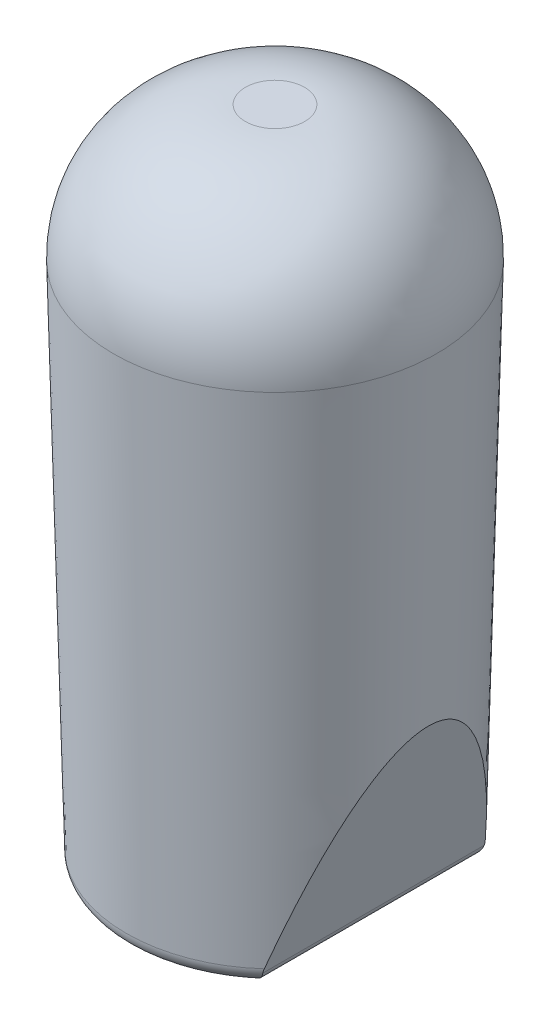
ISO-10303-21;
HEADER;
FILE_DESCRIPTION(('STEP AP214'),'2;1');
FILE_NAME('part.step','',(''),(''),'','','');
FILE_SCHEMA(('AUTOMOTIVE_DESIGN { 1 0 10303 214 1 1 1 1 }'));
ENDSEC;
DATA;
#1=APPLICATION_CONTEXT('core data for automotive mechanical design processes');
#2=APPLICATION_PROTOCOL_DEFINITION('international standard','automotive_design',2000,#1);
#3=PRODUCT_CONTEXT('',#1,'mechanical');
#4=PRODUCT('Part','Part','',(#3));
#5=PRODUCT_RELATED_PRODUCT_CATEGORY('part','',(#4));
#6=PRODUCT_DEFINITION_FORMATION('','',#4);
#7=PRODUCT_DEFINITION_CONTEXT('part definition',#1,'design');
#8=PRODUCT_DEFINITION('design','',#6,#7);
#9=PRODUCT_DEFINITION_SHAPE('','',#8);
#10=(LENGTH_UNIT() NAMED_UNIT(*) SI_UNIT(.MILLI.,.METRE.));
#11=(NAMED_UNIT(*) PLANE_ANGLE_UNIT() SI_UNIT($,.RADIAN.));
#12=(NAMED_UNIT(*) SI_UNIT($,.STERADIAN.) SOLID_ANGLE_UNIT());
#13=UNCERTAINTY_MEASURE_WITH_UNIT(LENGTH_MEASURE(1.E-05),#10,'distance_accuracy_value','');
#14=(GEOMETRIC_REPRESENTATION_CONTEXT(3) GLOBAL_UNCERTAINTY_ASSIGNED_CONTEXT((#13)) GLOBAL_UNIT_ASSIGNED_CONTEXT((#10,
#11,#12)) REPRESENTATION_CONTEXT('',''));
#15=CARTESIAN_POINT('',(0.,0.,0.));
#16=DIRECTION('',(0.,0.,1.));
#17=DIRECTION('',(1.,0.,0.));
#18=AXIS2_PLACEMENT_3D('',#15,#16,#17);
#19=CARTESIAN_POINT('',(9.,0.,0.));
#20=DIRECTION('',(0.,-1.,0.));
#21=DIRECTION('',(0.,0.,-1.));
#22=AXIS2_PLACEMENT_3D('',#19,#20,#21);
#23=PLANE('',#22);
#24=DIRECTION('',(0.,0.,-1.));
#25=VECTOR('',#24,1.);
#26=CARTESIAN_POINT('',(-2.38,0.,7.));
#27=LINE('',#26,#25);
#28=CARTESIAN_POINT('',(-2.38,0.,7.));
#29=VERTEX_POINT('',#28);
#30=CARTESIAN_POINT('',(-2.38,0.,-7.));
#31=VERTEX_POINT('',#30);
#32=EDGE_CURVE('E54',#29,#31,#27,.T.);
#33=ORIENTED_EDGE('',*,*,#32,.F.);
#34=DIRECTION('',(-1.,0.,0.));
#35=VECTOR('',#34,1.);
#36=CARTESIAN_POINT('',(2.38,0.,7.));
#37=LINE('',#36,#35);
#38=CARTESIAN_POINT('',(2.38,0.,7.));
#39=VERTEX_POINT('',#38);
#40=EDGE_CURVE('E136',#39,#29,#37,.T.);
#41=ORIENTED_EDGE('',*,*,#40,.F.);
#42=DIRECTION('',(0.,0.,1.));
#43=VECTOR('',#42,1.);
#44=CARTESIAN_POINT('',(2.38,0.,7.));
#45=LINE('',#44,#43);
#46=CARTESIAN_POINT('',(2.38,0.,-7.));
#47=VERTEX_POINT('',#46);
#48=EDGE_CURVE('E139',#47,#39,#45,.T.);
#49=ORIENTED_EDGE('',*,*,#48,.F.);
#50=DIRECTION('',(1.,0.,0.));
#51=VECTOR('',#50,1.);
#52=CARTESIAN_POINT('',(2.38,0.,-7.));
#53=LINE('',#52,#51);
#54=EDGE_CURVE('E145',#31,#47,#53,.T.);
#55=ORIENTED_EDGE('',*,*,#54,.F.);
#56=EDGE_LOOP('',(#33,#41,#49,#55));
#57=FACE_BOUND('',#56,.T.);
#58=DIRECTION('',(0.,0.,1.));
#59=VECTOR('',#58,1.);
#60=CARTESIAN_POINT('',(-5.01324340538408,0.,0.));
#61=LINE('',#60,#59);
#62=CARTESIAN_POINT('',(-5.01324340538407,0.,6.26601953511522));
#63=VERTEX_POINT('',#62);
#64=CARTESIAN_POINT('',(-5.01324340538408,0.,-6.26601953511523));
#65=VERTEX_POINT('',#64);
#66=EDGE_CURVE('E169',#63,#65,#61,.F.);
#67=ORIENTED_EDGE('',*,*,#66,.T.);
#68=CARTESIAN_POINT('',(0.,0.,0.));
#69=DIRECTION('',(0.,-1.,0.));
#70=DIRECTION('',(0.,0.,-1.));
#71=AXIS2_PLACEMENT_3D('',#68,#69,#70);
#72=CIRCLE('',#71,8.02468754881287);
#73=CARTESIAN_POINT('',(5.01324340538408,0.,-6.26601953511523));
#74=VERTEX_POINT('',#73);
#75=EDGE_CURVE('E174',#65,#74,#72,.T.);
#76=ORIENTED_EDGE('',*,*,#75,.T.);
#77=DIRECTION('',(0.,0.,1.));
#78=VECTOR('',#77,1.);
#79=CARTESIAN_POINT('',(5.01324340538408,0.,6.91462258432967));
#80=LINE('',#79,#78);
#81=CARTESIAN_POINT('',(5.01324340538407,0.,6.26601953511522));
#82=VERTEX_POINT('',#81);
#83=EDGE_CURVE('E171',#74,#82,#80,.T.);
#84=ORIENTED_EDGE('',*,*,#83,.T.);
#85=CARTESIAN_POINT('',(0.,0.,0.));
#86=DIRECTION('',(0.,-1.,0.));
#87=DIRECTION('',(0.,0.,-1.));
#88=AXIS2_PLACEMENT_3D('',#85,#86,#87);
#89=CIRCLE('',#88,8.02468754881287);
#90=EDGE_CURVE('E167',#82,#63,#89,.T.);
#91=ORIENTED_EDGE('',*,*,#90,.T.);
#92=EDGE_LOOP('',(#67,#76,#84,#91));
#93=FACE_BOUND('',#92,.T.);
#94=ADVANCED_FACE('F32',(#57,#93),#23,.T.);
#95=CARTESIAN_POINT('',(0.,0.,0.));
#96=DIRECTION('',(0.,1.,0.));
#97=DIRECTION('',(0.,0.,1.));
#98=AXIS2_PLACEMENT_3D('',#95,#96,#97);
#99=CONICAL_SURFACE('',#98,9.,0.0249947936189201);
#100=CARTESIAN_POINT('',(0.72673325034867,-17.0693300139473,0.));
#101=DIRECTION('',(-0.959155660836636,0.282878804941331,0.));
#102=DIRECTION('',(0.282878804941331,0.959155660836636,0.));
#103=AXIS2_PLACEMENT_3D('',#100,#101,#102);
#104=ELLIPSE('',#103,30.3072078921905,8.54240958649927);
#105=CARTESIAN_POINT('',(6.04845622784257,0.975007808839801,-6.69742673897912));
#106=VERTEX_POINT('',#105);
#107=CARTESIAN_POINT('',(6.04845622784257,0.975007808839783,6.69742673897912));
#108=VERTEX_POINT('',#107);
#109=EDGE_CURVE('E164',#106,#108,#104,.F.);
#110=ORIENTED_EDGE('',*,*,#109,.F.);
#111=CARTESIAN_POINT('',(0.,0.975007808839801,0.));
#112=DIRECTION('',(0.,-1.,0.));
#113=DIRECTION('',(0.,0.,-1.));
#114=AXIS2_PLACEMENT_3D('',#111,#112,#113);
#115=CIRCLE('',#114,9.024375195221);
#116=CARTESIAN_POINT('',(-6.04845622784257,0.975007808839797,-6.69742673897911));
#117=VERTEX_POINT('',#116);
#118=EDGE_CURVE('E11',#106,#117,#115,.F.);
#119=ORIENTED_EDGE('',*,*,#118,.T.);
#120=CARTESIAN_POINT('',(-0.726733250348684,-17.0693300139473,0.));
#121=DIRECTION('',(-0.959155660836636,-0.282878804941331,0.));
#122=DIRECTION('',(-0.282878804941331,0.959155660836636,0.));
#123=AXIS2_PLACEMENT_3D('',#120,#121,#122);
#124=ELLIPSE('',#123,30.3072078921905,8.54240958649926);
#125=CARTESIAN_POINT('',(-6.04845622784257,0.975007808839801,6.69742673897911));
#126=VERTEX_POINT('',#125);
#127=EDGE_CURVE('E161',#117,#126,#124,.F.);
#128=ORIENTED_EDGE('',*,*,#127,.T.);
#129=CARTESIAN_POINT('',(0.,0.975007808839801,0.));
#130=DIRECTION('',(0.,-1.,0.));
#131=DIRECTION('',(0.,0.,-1.));
#132=AXIS2_PLACEMENT_3D('',#129,#130,#131);
#133=CIRCLE('',#132,9.024375195221);
#134=EDGE_CURVE('E46',#126,#108,#133,.F.);
#135=ORIENTED_EDGE('',*,*,#134,.T.);
#136=EDGE_LOOP('',(#110,#119,#128,#135));
#137=FACE_BOUND('',#136,.T.);
#138=CARTESIAN_POINT('',(0.,31.8000624707184,0.));
#139=DIRECTION('',(0.,-1.,0.));
#140=DIRECTION('',(0.,0.,-1.));
#141=AXIS2_PLACEMENT_3D('',#138,#139,#140);
#142=CIRCLE('',#141,9.79500156176796);
#143=CARTESIAN_POINT('',(0.,31.8000624707184,-9.79500156176796));
#144=VERTEX_POINT('',#143);
#145=EDGE_CURVE('E155',#144,#144,#142,.T.);
#146=ORIENTED_EDGE('',*,*,#145,.T.);
#147=EDGE_LOOP('',(#146));
#148=FACE_BOUND('',#147,.T.);
#149=ADVANCED_FACE('F250',(#137,#148),#99,.T.);
#150=CARTESIAN_POINT('',(0.,40.,0.));
#151=DIRECTION('',(0.,1.,0.));
#152=DIRECTION('',(0.,0.,1.));
#153=AXIS2_PLACEMENT_3D('',#150,#151,#152);
#154=PLANE('',#153);
#155=CARTESIAN_POINT('',(0.,40.,0.));
#156=DIRECTION('',(0.,1.,0.));
#157=DIRECTION('',(0.,0.,1.));
#158=AXIS2_PLACEMENT_3D('',#155,#156,#157);
#159=CIRCLE('',#158,1.79750039050298);
#160=CARTESIAN_POINT('',(0.,40.,1.79750039050298));
#161=VERTEX_POINT('',#160);
#162=EDGE_CURVE('E158',#161,#161,#159,.T.);
#163=ORIENTED_EDGE('',*,*,#162,.T.);
#164=EDGE_LOOP('',(#163));
#165=FACE_BOUND('',#164,.T.);
#166=ADVANCED_FACE('F246',(#165),#154,.T.);
#167=CARTESIAN_POINT('',(0.,32.,0.));
#168=DIRECTION('',(0.,1.,0.));
#169=DIRECTION('',(0.,0.,1.));
#170=AXIS2_PLACEMENT_3D('',#167,#168,#169);
#171=DEGENERATE_TOROIDAL_SURFACE('',#170,1.79750039050298,8.,.T.);
#172=ORIENTED_EDGE('',*,*,#162,.F.);
#173=EDGE_LOOP('',(#172));
#174=FACE_BOUND('',#173,.T.);
#175=ORIENTED_EDGE('',*,*,#145,.F.);
#176=EDGE_LOOP('',(#175));
#177=FACE_BOUND('',#176,.T.);
#178=ADVANCED_FACE('F242',(#174,#177),#171,.T.);
#179=CARTESIAN_POINT('',(-9.3,12.,-72.0767019800829));
#180=DIRECTION('',(-0.959155660836636,-0.282878804941331,0.));
#181=DIRECTION('',(0.282878804941331,-0.959155660836636,0.));
#182=AXIS2_PLACEMENT_3D('',#179,#180,#181);
#183=PLANE('',#182);
#184=ORIENTED_EDGE('',*,*,#127,.F.);
#185=CARTESIAN_POINT('',(-6.04845622784257,0.975007808839797,-6.69742673897911));
#186=CARTESIAN_POINT('',(-6.04220976078651,0.953827946183432,-6.70235788528759));
#187=CARTESIAN_POINT('',(-6.03590546793275,0.932452013902093,-6.70640596599613));
#188=CARTESIAN_POINT('',(-6.02327098596144,0.889612343015337,-6.71260923101548));
#189=CARTESIAN_POINT('',(-6.01694133906214,0.868150442906492,-6.71477828334975));
#190=CARTESIAN_POINT('',(-6.0042507214956,0.825120433355298,-6.71717328582127));
#191=CARTESIAN_POINT('',(-5.99788974646449,0.803552309116398,-6.71739895712802));
#192=CARTESIAN_POINT('',(-5.98514013425925,0.760322266757202,-6.71583606493878));
#193=CARTESIAN_POINT('',(-5.97875164745178,0.738660858484362,-6.71403238115715));
#194=CARTESIAN_POINT('',(-5.97239906622071,0.717121195058671,-6.71117636553917));
#195=B_SPLINE_CURVE_WITH_KNOTS('',3,(#185,#186,#187,#188,#189,#190,#191,#192,#193,#194),
.UNSPECIFIED.,.F.,.F.,(4,2,2,2,4),(0.,0.0678693443602504,0.135233409343509,0.202607139359977,
0.270486200087772),.UNSPECIFIED.);
#196=CARTESIAN_POINT('',(-5.97239906622071,0.71712119505867,-6.71117636553917));
#197=VERTEX_POINT('',#196);
#198=EDGE_CURVE('E62',#117,#197,#195,.T.);
#199=ORIENTED_EDGE('',*,*,#198,.T.);
#200=DIRECTION('',(0.,0.,1.));
#201=VECTOR('',#200,1.);
#202=CARTESIAN_POINT('',(-5.97239906622071,0.71712119505867,-72.0767019800829));
#203=LINE('',#202,#201);
#204=CARTESIAN_POINT('',(-5.97239906622071,0.71712119505867,6.71117636553917));
#205=VERTEX_POINT('',#204);
#206=EDGE_CURVE('E232',#197,#205,#203,.T.);
#207=ORIENTED_EDGE('',*,*,#206,.T.);
#208=CARTESIAN_POINT('',(-5.97239906622071,0.71712119505867,6.71117636553917));
#209=CARTESIAN_POINT('',(-5.97875164745178,0.73866085848437,6.71403238115715));
#210=CARTESIAN_POINT('',(-5.98514013425925,0.760322266757219,6.71583606493878));
#211=CARTESIAN_POINT('',(-5.99788974646451,0.803552309116433,6.71739895712802));
#212=CARTESIAN_POINT('',(-6.00425072149561,0.825120433355341,6.71717328582126));
#213=CARTESIAN_POINT('',(-6.01694133906215,0.868150442906553,6.71477828334975));
#214=CARTESIAN_POINT('',(-6.02327098596146,0.889612343015406,6.71260923101547));
#215=CARTESIAN_POINT('',(-6.03590546793278,0.932452013902179,6.70640596599612));
#216=CARTESIAN_POINT('',(-6.04220976078654,0.953827946183526,6.70235788528758));
#217=CARTESIAN_POINT('',(-6.0484562278426,0.9750078088399,6.69742673897909));
#218=B_SPLINE_CURVE_WITH_KNOTS('',3,(#208,#209,#210,#211,#212,#213,#214,#215,#216,#217),
.UNSPECIFIED.,.F.,.F.,(4,2,2,2,4),(0.,0.0678790607278224,0.135252790744318,0.202616855727603,
0.270486200087882),.UNSPECIFIED.);
#219=EDGE_CURVE('E206',#205,#126,#218,.T.);
#220=ORIENTED_EDGE('',*,*,#219,.T.);
#221=EDGE_LOOP('',(#184,#199,#207,#220));
#222=FACE_BOUND('',#221,.T.);
#223=ADVANCED_FACE('F194',(#222),#183,.T.);
#224=CARTESIAN_POINT('',(9.3,12.,-69.469980210495));
#225=DIRECTION('',(-0.959155660836636,0.282878804941331,0.));
#226=DIRECTION('',(-0.282878804941331,-0.959155660836636,0.));
#227=AXIS2_PLACEMENT_3D('',#224,#225,#226);
#228=PLANE('',#227);
#229=DIRECTION('',(0.,0.,1.));
#230=VECTOR('',#229,1.);
#231=CARTESIAN_POINT('',(5.97239906622071,0.717121195058669,-6.91462258432967));
#232=LINE('',#231,#230);
#233=CARTESIAN_POINT('',(5.97239906622071,0.717121195058669,6.71117636553917));
#234=VERTEX_POINT('',#233);
#235=CARTESIAN_POINT('',(5.97239906622071,0.717121195058669,-6.71117636553917));
#236=VERTEX_POINT('',#235);
#237=EDGE_CURVE('E184',#234,#236,#232,.F.);
#238=ORIENTED_EDGE('',*,*,#237,.T.);
#239=CARTESIAN_POINT('',(5.97239906622071,0.717121195058669,-6.71117636553917));
#240=CARTESIAN_POINT('',(5.97875164745178,0.73866085848436,-6.71403238115715));
#241=CARTESIAN_POINT('',(5.98514013425925,0.7603222667572,-6.71583606493878));
#242=CARTESIAN_POINT('',(5.99788974646449,0.803552309116396,-6.71739895712802));
#243=CARTESIAN_POINT('',(6.0042507214956,0.825120433355296,-6.71717328582127));
#244=CARTESIAN_POINT('',(6.01694133906214,0.868150442906491,-6.71477828334975));
#245=CARTESIAN_POINT('',(6.02327098596144,0.889612343015336,-6.71260923101548));
#246=CARTESIAN_POINT('',(6.03590546793275,0.932452013902092,-6.70640596599614));
#247=CARTESIAN_POINT('',(6.04220976078651,0.953827946183431,-6.7023578852876));
#248=CARTESIAN_POINT('',(6.04845622784257,0.975007808839796,-6.69742673897911));
#249=B_SPLINE_CURVE_WITH_KNOTS('',3,(#239,#240,#241,#242,#243,#244,#245,#246,#247,#248),
.UNSPECIFIED.,.F.,.F.,(4,2,2,2,4),(0.,0.0678790607277951,0.135252790744263,0.202616855727522,
0.270486200087772),.UNSPECIFIED.);
#250=EDGE_CURVE('E200',#236,#106,#249,.T.);
#251=ORIENTED_EDGE('',*,*,#250,.T.);
#252=ORIENTED_EDGE('',*,*,#109,.T.);
#253=CARTESIAN_POINT('',(6.04845622784257,0.975007808839797,6.69742673897911));
#254=CARTESIAN_POINT('',(6.04220976078651,0.953827946183431,6.7023578852876));
#255=CARTESIAN_POINT('',(6.03590546793275,0.932452013902092,6.70640596599614));
#256=CARTESIAN_POINT('',(6.02327098596144,0.889612343015336,6.71260923101548));
#257=CARTESIAN_POINT('',(6.01694133906214,0.868150442906491,6.71477828334975));
#258=CARTESIAN_POINT('',(6.0042507214956,0.825120433355296,6.71717328582127));
#259=CARTESIAN_POINT('',(5.99788974646449,0.803552309116396,6.71739895712802));
#260=CARTESIAN_POINT('',(5.98514013425925,0.760322266757201,6.71583606493878));
#261=CARTESIAN_POINT('',(5.97875164745178,0.73866085848436,6.71403238115715));
#262=CARTESIAN_POINT('',(5.97239906622071,0.717121195058669,6.71117636553917));
#263=B_SPLINE_CURVE_WITH_KNOTS('',3,(#253,#254,#255,#256,#257,#258,#259,#260,#261,#262),
.UNSPECIFIED.,.F.,.F.,(4,2,2,2,4),(0.,0.06786934436025,0.135233409343509,0.202607139359977,
0.270486200087772),.UNSPECIFIED.);
#264=EDGE_CURVE('E176',#108,#234,#263,.T.);
#265=ORIENTED_EDGE('',*,*,#264,.T.);
#266=EDGE_LOOP('',(#238,#251,#252,#265));
#267=FACE_BOUND('',#266,.T.);
#268=ADVANCED_FACE('F189',(#267),#228,.F.);
#269=CARTESIAN_POINT('',(-5.01324340538408,0.999999999999999,-72.0767019800829));
#270=DIRECTION('',(0.,0.,1.));
#271=DIRECTION('',(1.,0.,0.));
#272=AXIS2_PLACEMENT_3D('',#269,#270,#271);
#273=CYLINDRICAL_SURFACE('',#272,1.);
#274=CARTESIAN_POINT('',(-5.97239906622071,0.717121195058668,6.71117636553917));
#275=CARTESIAN_POINT('',(-5.964597802691,0.690666174343034,6.70767563511496));
#276=CARTESIAN_POINT('',(-5.95572174374482,0.664609644277068,6.70369017099201));
#277=CARTESIAN_POINT('',(-5.93592455640818,0.613462326676844,6.69479100193588));
#278=CARTESIAN_POINT('',(-5.92500432807718,0.5883711199445,6.68987770552421));
#279=CARTESIAN_POINT('',(-5.88943366585486,0.514993759894755,6.67385276022762));
#280=CARTESIAN_POINT('',(-5.86189825824856,0.46835332389664,6.66142250695135));
#281=CARTESIAN_POINT('',(-5.80029769639917,0.380796735284814,6.63351600914163));
#282=CARTESIAN_POINT('',(-5.76624132753651,0.339873007684555,6.61804386206394));
#283=CARTESIAN_POINT('',(-5.6927179840039,0.264411213276677,6.58450312536579));
#284=CARTESIAN_POINT('',(-5.65324684864317,0.229878105403639,6.56643253859226));
#285=CARTESIAN_POINT('',(-5.56757303340255,0.165884217415277,6.52702666320147));
#286=CARTESIAN_POINT('',(-5.52110734651739,0.136857769725877,6.50555988011003));
#287=CARTESIAN_POINT('',(-5.42476550227872,0.0869864616719437,6.46080900471711));
#288=CARTESIAN_POINT('',(-5.37488740979032,0.0661462895678663,6.43752388017939));
#289=CARTESIAN_POINT('',(-5.27448875851816,0.0333245473173011,6.39038279769287));
#290=CARTESIAN_POINT('',(-5.22402836329687,0.0211045050008467,6.36656275087413));
#291=CARTESIAN_POINT('',(-5.12224088152588,0.0046262075999059,6.31823251812219));
#292=CARTESIAN_POINT('',(-5.07091579525187,0.00035159751159655,6.29372385551423));
#293=CARTESIAN_POINT('',(-5.01754403842603,6.92076652850028E-06,6.26808616240055));
#294=CARTESIAN_POINT('',(-5.01539360853196,-1.54334389489813E-08,6.26705292325662));
#295=CARTESIAN_POINT('',(-5.0132434053841,0.,6.26601953511524));
#296=B_SPLINE_CURVE_WITH_KNOTS('',3,(#274,#275,#276,#277,#278,#279,#280,#281,#282,#283,#284,
#285,#286,#287,#288,#289,#290,#291,#292,#293,#294,#295),.UNSPECIFIED.,.F.,.F.,(4,2,2,2,2,2,2,2,
2,2,4),(0.,0.0833490158413959,0.166661418590738,0.332505985276801,0.498128669906504,
0.66387933889825,0.839676850173068,1.01557489398826,1.1863925982709,1.35685829762305,
1.36401561090144),.UNSPECIFIED.);
#297=EDGE_CURVE('E273',#205,#63,#296,.T.);
#298=ORIENTED_EDGE('',*,*,#297,.F.);
#299=ORIENTED_EDGE('',*,*,#206,.F.);
#300=CARTESIAN_POINT('',(-5.97239906622071,0.717121195058668,-6.71117636553917));
#301=CARTESIAN_POINT('',(-5.964597802691,0.690666174343035,-6.70767563511496));
#302=CARTESIAN_POINT('',(-5.95572174374482,0.664609644277069,-6.70369017099201));
#303=CARTESIAN_POINT('',(-5.93592455640818,0.613462326676845,-6.69479100193589));
#304=CARTESIAN_POINT('',(-5.92500432807718,0.588371119944501,-6.68987770552421));
#305=CARTESIAN_POINT('',(-5.88943366585486,0.514993759894756,-6.67385276022762));
#306=CARTESIAN_POINT('',(-5.86189825824856,0.468353323896642,-6.66142250695135));
#307=CARTESIAN_POINT('',(-5.80029769639917,0.380796735284816,-6.63351600914163));
#308=CARTESIAN_POINT('',(-5.76624132753651,0.339873007684557,-6.61804386206394));
#309=CARTESIAN_POINT('',(-5.6927179840039,0.264411213276679,-6.58450312536579));
#310=CARTESIAN_POINT('',(-5.65324684864318,0.229878105403641,-6.56643253859226));
#311=CARTESIAN_POINT('',(-5.56757303340255,0.16588421741528,-6.52702666320147));
#312=CARTESIAN_POINT('',(-5.52110734651739,0.13685776972588,-6.50555988011003));
#313=CARTESIAN_POINT('',(-5.42476550227872,0.0869864616719463,-6.46080900471711));
#314=CARTESIAN_POINT('',(-5.37488740979032,0.0661462895678689,-6.43752388017939));
#315=CARTESIAN_POINT('',(-5.27448875851815,0.0333245473172997,-6.39038279769287));
#316=CARTESIAN_POINT('',(-5.22402836329685,0.0211045050008431,-6.36656275087412));
#317=CARTESIAN_POINT('',(-5.12224088152585,0.00462620759990119,-6.31823251812217));
#318=CARTESIAN_POINT('',(-5.07091579525183,0.000351597511593099,-6.2937238555142));
#319=CARTESIAN_POINT('',(-5.01754403842599,6.92076652823866E-06,-6.26808616240049));
#320=CARTESIAN_POINT('',(-5.01539360853192,-1.54334390790782E-08,-6.26705292325657));
#321=CARTESIAN_POINT('',(-5.01324340538406,0.,-6.26601953511518));
#322=B_SPLINE_CURVE_WITH_KNOTS('',3,(#300,#301,#302,#303,#304,#305,#306,#307,#308,#309,#310,
#311,#312,#313,#314,#315,#316,#317,#318,#319,#320,#321),.UNSPECIFIED.,.F.,.F.,(4,2,2,2,2,2,2,2,
2,2,4),(0.,0.0833490158413951,0.166661418590737,0.332505985276799,0.498128669906501,
0.663879338898245,0.839676850173063,1.01557489398825,1.18639259827093,1.35685829762311,
1.3640156109015),.UNSPECIFIED.);
#323=EDGE_CURVE('E37',#65,#197,#322,.F.);
#324=ORIENTED_EDGE('',*,*,#323,.F.);
#325=ORIENTED_EDGE('',*,*,#66,.F.);
#326=EDGE_LOOP('',(#298,#299,#324,#325));
#327=FACE_BOUND('',#326,.T.);
#328=ADVANCED_FACE('F34',(#327),#273,.T.);
#329=CARTESIAN_POINT('',(0.,1.,0.));
#330=DIRECTION('',(0.,-1.,0.));
#331=DIRECTION('',(0.,0.,-1.));
#332=AXIS2_PLACEMENT_3D('',#329,#330,#331);
#333=TOROIDAL_SURFACE('',#332,8.02468754881287,1.);
#334=ORIENTED_EDGE('',*,*,#118,.F.);
#335=ORIENTED_EDGE('',*,*,#250,.F.);
#336=CARTESIAN_POINT('',(5.97239906622071,0.717121195058669,-6.71117636553917));
#337=CARTESIAN_POINT('',(5.964597802691,0.690666174343035,-6.70767563511496));
#338=CARTESIAN_POINT('',(5.95572174374482,0.66460964427707,-6.70369017099201));
#339=CARTESIAN_POINT('',(5.93592455640818,0.613462326676846,-6.69479100193588));
#340=CARTESIAN_POINT('',(5.92500432807718,0.588371119944502,-6.68987770552421));
#341=CARTESIAN_POINT('',(5.88943366585486,0.514993759894757,-6.67385276022762));
#342=CARTESIAN_POINT('',(5.86189825824856,0.468353323896642,-6.66142250695135));
#343=CARTESIAN_POINT('',(5.80029769639917,0.380796735284815,-6.63351600914163));
#344=CARTESIAN_POINT('',(5.76624132753651,0.339873007684554,-6.61804386206394));
#345=CARTESIAN_POINT('',(5.6927179840039,0.264411213276677,-6.5845031253658));
#346=CARTESIAN_POINT('',(5.65324684864317,0.229878105403639,-6.56643253859226));
#347=CARTESIAN_POINT('',(5.56757303340256,0.16588421741528,-6.52702666320146));
#348=CARTESIAN_POINT('',(5.52110734651741,0.13685776972588,-6.50555988011));
#349=CARTESIAN_POINT('',(5.42476550227871,0.0869864616719466,-6.46080900471714));
#350=CARTESIAN_POINT('',(5.37488740979027,0.0661462895678687,-6.43752388017949));
#351=CARTESIAN_POINT('',(5.2744887585182,0.0333245473173003,-6.39038279769278));
#352=CARTESIAN_POINT('',(5.22402836329702,0.0211045050008443,-6.36656275087378));
#353=CARTESIAN_POINT('',(5.12224088152569,0.00462620759990355,-6.31823251812254));
#354=CARTESIAN_POINT('',(5.07091579525122,0.000351597511595374,-6.29372385551552));
#355=CARTESIAN_POINT('',(5.01754403842596,6.92076652881374E-06,-6.26808616240063));
#356=CARTESIAN_POINT('',(5.01539360853192,-1.54334385750698E-08,-6.26705292325665));
#357=CARTESIAN_POINT('',(5.01324340538408,0.,-6.26601953511521));
#358=B_SPLINE_CURVE_WITH_KNOTS('',3,(#336,#337,#338,#339,#340,#341,#342,#343,#344,#345,#346,
#347,#348,#349,#350,#351,#352,#353,#354,#355,#356,#357),.UNSPECIFIED.,.F.,.F.,(4,2,2,2,2,2,2,2,
2,2,4),(0.,0.0833490158413951,0.166661418590737,0.3325059852768,0.498128669906506,
0.663879338898249,0.839676850173061,1.01557489398825,1.18639259827092,1.35685829762308,
1.36401561090147),.UNSPECIFIED.);
#359=EDGE_CURVE('E219',#74,#236,#358,.F.);
#360=ORIENTED_EDGE('',*,*,#359,.F.);
#361=ORIENTED_EDGE('',*,*,#75,.F.);
#362=ORIENTED_EDGE('',*,*,#323,.T.);
#363=ORIENTED_EDGE('',*,*,#198,.F.);
#364=EDGE_LOOP('',(#334,#335,#360,#361,#362,#363));
#365=FACE_BOUND('',#364,.T.);
#366=ADVANCED_FACE('F212',(#365),#333,.T.);
#367=CARTESIAN_POINT('',(0.,1.,0.));
#368=DIRECTION('',(0.,-1.,0.));
#369=DIRECTION('',(0.,0.,-1.));
#370=AXIS2_PLACEMENT_3D('',#367,#368,#369);
#371=TOROIDAL_SURFACE('',#370,8.02468754881287,1.);
#372=ORIENTED_EDGE('',*,*,#297,.T.);
#373=ORIENTED_EDGE('',*,*,#90,.F.);
#374=CARTESIAN_POINT('',(5.97239906622071,0.717121195058669,6.71117636553917));
#375=CARTESIAN_POINT('',(5.964597802691,0.690666174343035,6.70767563511496));
#376=CARTESIAN_POINT('',(5.95572174374482,0.66460964427707,6.70369017099201));
#377=CARTESIAN_POINT('',(5.93592455640818,0.613462326676846,6.69479100193588));
#378=CARTESIAN_POINT('',(5.92500432807718,0.588371119944502,6.68987770552421));
#379=CARTESIAN_POINT('',(5.88943366585486,0.514993759894757,6.67385276022762));
#380=CARTESIAN_POINT('',(5.86189825824856,0.468353323896642,6.66142250695135));
#381=CARTESIAN_POINT('',(5.80029769639917,0.380796735284815,6.63351600914163));
#382=CARTESIAN_POINT('',(5.76624132753651,0.339873007684554,6.61804386206394));
#383=CARTESIAN_POINT('',(5.6927179840039,0.264411213276677,6.5845031253658));
#384=CARTESIAN_POINT('',(5.65324684864317,0.229878105403639,6.56643253859226));
#385=CARTESIAN_POINT('',(5.56757303340256,0.16588421741528,6.52702666320146));
#386=CARTESIAN_POINT('',(5.52110734651741,0.13685776972588,6.50555988011));
#387=CARTESIAN_POINT('',(5.42476550227871,0.0869864616719466,6.46080900471714));
#388=CARTESIAN_POINT('',(5.37488740979027,0.0661462895678687,6.43752388017949));
#389=CARTESIAN_POINT('',(5.2744887585182,0.0333245473173003,6.39038279769278));
#390=CARTESIAN_POINT('',(5.22402836329702,0.0211045050008443,6.36656275087378));
#391=CARTESIAN_POINT('',(5.12224088152569,0.00462620759990355,6.31823251812254));
#392=CARTESIAN_POINT('',(5.07091579525122,0.000351597511595374,6.29372385551552));
#393=CARTESIAN_POINT('',(5.01754403842596,6.92076652881374E-06,6.26808616240063));
#394=CARTESIAN_POINT('',(5.01539360853192,-1.54334385750698E-08,6.26705292325665));
#395=CARTESIAN_POINT('',(5.01324340538408,0.,6.26601953511521));
#396=B_SPLINE_CURVE_WITH_KNOTS('',3,(#374,#375,#376,#377,#378,#379,#380,#381,#382,#383,#384,
#385,#386,#387,#388,#389,#390,#391,#392,#393,#394,#395),.UNSPECIFIED.,.F.,.F.,(4,2,2,2,2,2,2,2,
2,2,4),(0.,0.0833490158413951,0.166661418590737,0.3325059852768,0.498128669906506,
0.663879338898249,0.839676850173061,1.01557489398825,1.18639259827092,1.35685829762308,
1.36401561090147),.UNSPECIFIED.);
#397=EDGE_CURVE('E151',#234,#82,#396,.T.);
#398=ORIENTED_EDGE('',*,*,#397,.F.);
#399=ORIENTED_EDGE('',*,*,#264,.F.);
#400=ORIENTED_EDGE('',*,*,#134,.F.);
#401=ORIENTED_EDGE('',*,*,#219,.F.);
#402=EDGE_LOOP('',(#372,#373,#398,#399,#400,#401));
#403=FACE_BOUND('',#402,.T.);
#404=ADVANCED_FACE('F186',(#403),#371,.T.);
#405=CARTESIAN_POINT('',(5.01324340538408,1.,0.));
#406=DIRECTION('',(0.,0.,-1.));
#407=DIRECTION('',(-1.,0.,0.));
#408=AXIS2_PLACEMENT_3D('',#405,#406,#407);
#409=CYLINDRICAL_SURFACE('',#408,1.);
#410=ORIENTED_EDGE('',*,*,#359,.T.);
#411=ORIENTED_EDGE('',*,*,#237,.F.);
#412=ORIENTED_EDGE('',*,*,#397,.T.);
#413=ORIENTED_EDGE('',*,*,#83,.F.);
#414=EDGE_LOOP('',(#410,#411,#412,#413));
#415=FACE_BOUND('',#414,.T.);
#416=ADVANCED_FACE('F237',(#415),#409,.T.);
#417=CARTESIAN_POINT('',(-2.38,25.,7.));
#418=DIRECTION('',(-1.,0.,0.));
#419=DIRECTION('',(0.,0.,1.));
#420=AXIS2_PLACEMENT_3D('',#417,#418,#419);
#421=PLANE('',#420);
#422=ORIENTED_EDGE('',*,*,#32,.T.);
#423=DIRECTION('',(0.,-1.,0.));
#424=VECTOR('',#423,1.);
#425=CARTESIAN_POINT('',(-2.38,25.,-7.));
#426=LINE('',#425,#424);
#427=CARTESIAN_POINT('',(-2.38,25.,-7.));
#428=VERTEX_POINT('',#427);
#429=EDGE_CURVE('E114',#428,#31,#426,.T.);
#430=ORIENTED_EDGE('',*,*,#429,.F.);
#431=DIRECTION('',(0.,0.,-1.));
#432=VECTOR('',#431,1.);
#433=CARTESIAN_POINT('',(-2.38,25.,7.));
#434=LINE('',#433,#432);
#435=CARTESIAN_POINT('',(-2.38,25.,7.));
#436=VERTEX_POINT('',#435);
#437=EDGE_CURVE('E118',#436,#428,#434,.T.);
#438=ORIENTED_EDGE('',*,*,#437,.F.);
#439=DIRECTION('',(0.,-1.,0.));
#440=VECTOR('',#439,1.);
#441=CARTESIAN_POINT('',(-2.38,25.,7.));
#442=LINE('',#441,#440);
#443=EDGE_CURVE('E149',#436,#29,#442,.T.);
#444=ORIENTED_EDGE('',*,*,#443,.T.);
#445=EDGE_LOOP('',(#422,#430,#438,#444));
#446=FACE_BOUND('',#445,.T.);
#447=ADVANCED_FACE('F116',(#446),#421,.F.);
#448=CARTESIAN_POINT('',(2.38,25.,7.));
#449=DIRECTION('',(0.,0.,1.));
#450=DIRECTION('',(1.,0.,0.));
#451=AXIS2_PLACEMENT_3D('',#448,#449,#450);
#452=PLANE('',#451);
#453=ORIENTED_EDGE('',*,*,#40,.T.);
#454=ORIENTED_EDGE('',*,*,#443,.F.);
#455=DIRECTION('',(-1.,0.,0.));
#456=VECTOR('',#455,1.);
#457=CARTESIAN_POINT('',(2.38,25.,7.));
#458=LINE('',#457,#456);
#459=CARTESIAN_POINT('',(2.38,25.,7.));
#460=VERTEX_POINT('',#459);
#461=EDGE_CURVE('E124',#460,#436,#458,.T.);
#462=ORIENTED_EDGE('',*,*,#461,.F.);
#463=DIRECTION('',(0.,-1.,0.));
#464=VECTOR('',#463,1.);
#465=CARTESIAN_POINT('',(2.38,25.,7.));
#466=LINE('',#465,#464);
#467=EDGE_CURVE('E152',#460,#39,#466,.T.);
#468=ORIENTED_EDGE('',*,*,#467,.T.);
#469=EDGE_LOOP('',(#453,#454,#462,#468));
#470=FACE_BOUND('',#469,.T.);
#471=ADVANCED_FACE('F321',(#470),#452,.F.);
#472=CARTESIAN_POINT('',(2.38,25.,7.));
#473=DIRECTION('',(1.,0.,0.));
#474=DIRECTION('',(0.,0.,-1.));
#475=AXIS2_PLACEMENT_3D('',#472,#473,#474);
#476=PLANE('',#475);
#477=ORIENTED_EDGE('',*,*,#48,.T.);
#478=ORIENTED_EDGE('',*,*,#467,.F.);
#479=DIRECTION('',(0.,0.,1.));
#480=VECTOR('',#479,1.);
#481=CARTESIAN_POINT('',(2.38,25.,7.));
#482=LINE('',#481,#480);
#483=CARTESIAN_POINT('',(2.38,25.,-7.));
#484=VERTEX_POINT('',#483);
#485=EDGE_CURVE('E132',#484,#460,#482,.T.);
#486=ORIENTED_EDGE('',*,*,#485,.F.);
#487=DIRECTION('',(0.,-1.,0.));
#488=VECTOR('',#487,1.);
#489=CARTESIAN_POINT('',(2.38,25.,-7.));
#490=LINE('',#489,#488);
#491=EDGE_CURVE('E123',#484,#47,#490,.T.);
#492=ORIENTED_EDGE('',*,*,#491,.T.);
#493=EDGE_LOOP('',(#477,#478,#486,#492));
#494=FACE_BOUND('',#493,.T.);
#495=ADVANCED_FACE('F327',(#494),#476,.F.);
#496=CARTESIAN_POINT('',(2.38,25.,-7.));
#497=DIRECTION('',(0.,0.,-1.));
#498=DIRECTION('',(-1.,0.,0.));
#499=AXIS2_PLACEMENT_3D('',#496,#497,#498);
#500=PLANE('',#499);
#501=ORIENTED_EDGE('',*,*,#54,.T.);
#502=ORIENTED_EDGE('',*,*,#491,.F.);
#503=DIRECTION('',(1.,0.,0.));
#504=VECTOR('',#503,1.);
#505=CARTESIAN_POINT('',(2.38,25.,-7.));
#506=LINE('',#505,#504);
#507=EDGE_CURVE('E127',#428,#484,#506,.T.);
#508=ORIENTED_EDGE('',*,*,#507,.F.);
#509=ORIENTED_EDGE('',*,*,#429,.T.);
#510=EDGE_LOOP('',(#501,#502,#508,#509));
#511=FACE_BOUND('',#510,.T.);
#512=ADVANCED_FACE('F128',(#511),#500,.F.);
#513=CARTESIAN_POINT('',(0.,25.,0.));
#514=DIRECTION('',(0.,1.,0.));
#515=DIRECTION('',(0.,0.,1.));
#516=AXIS2_PLACEMENT_3D('',#513,#514,#515);
#517=PLANE('',#516);
#518=ORIENTED_EDGE('',*,*,#437,.T.);
#519=ORIENTED_EDGE('',*,*,#507,.T.);
#520=ORIENTED_EDGE('',*,*,#485,.T.);
#521=ORIENTED_EDGE('',*,*,#461,.T.);
#522=EDGE_LOOP('',(#518,#519,#520,#521));
#523=FACE_BOUND('',#522,.T.);
#524=ADVANCED_FACE('F134',(#523),#517,.F.);
#525=CLOSED_SHELL('',(#94,#149,#166,#178,#223,#268,#328,#366,#404,#416,#447,#471,#495,#512,#524));
#526=MANIFOLD_SOLID_BREP('B2',#525);
#527=ADVANCED_BREP_SHAPE_REPRESENTATION('',(#18,#526),#14);
#528=SHAPE_DEFINITION_REPRESENTATION(#9,#527);
ENDSEC;
END-ISO-10303-21;
